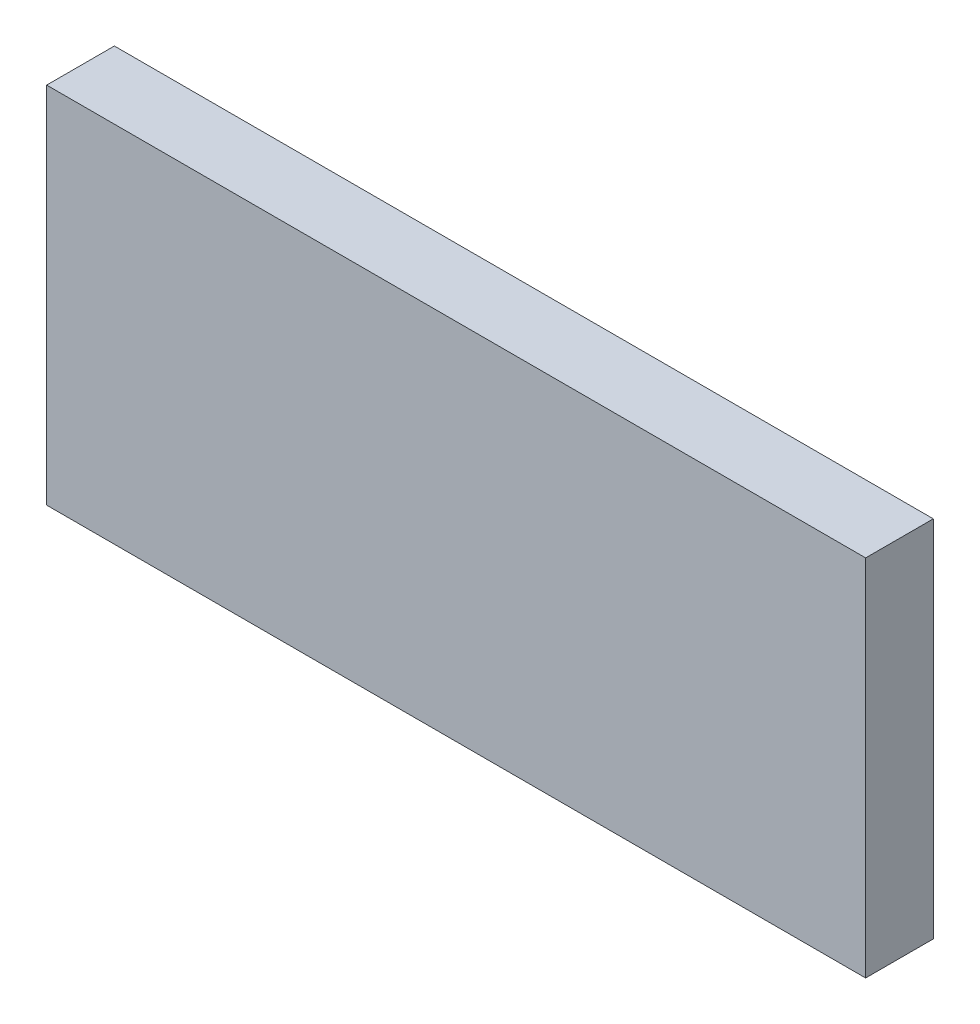
ISO-10303-21;
HEADER;
FILE_DESCRIPTION(('STEP AP214'),'2;1');
FILE_NAME('part.step','',(''),(''),'','','');
FILE_SCHEMA(('AUTOMOTIVE_DESIGN { 1 0 10303 214 1 1 1 1 }'));
ENDSEC;
DATA;
#1=APPLICATION_CONTEXT('core data for automotive mechanical design processes');
#2=APPLICATION_PROTOCOL_DEFINITION('international standard','automotive_design',2000,#1);
#3=PRODUCT_CONTEXT('',#1,'mechanical');
#4=PRODUCT('Part','Part','',(#3));
#5=PRODUCT_RELATED_PRODUCT_CATEGORY('part','',(#4));
#6=PRODUCT_DEFINITION_FORMATION('','',#4);
#7=PRODUCT_DEFINITION_CONTEXT('part definition',#1,'design');
#8=PRODUCT_DEFINITION('design','',#6,#7);
#9=PRODUCT_DEFINITION_SHAPE('','',#8);
#10=(LENGTH_UNIT() NAMED_UNIT(*) SI_UNIT(.MILLI.,.METRE.));
#11=(NAMED_UNIT(*) PLANE_ANGLE_UNIT() SI_UNIT($,.RADIAN.));
#12=(NAMED_UNIT(*) SI_UNIT($,.STERADIAN.) SOLID_ANGLE_UNIT());
#13=UNCERTAINTY_MEASURE_WITH_UNIT(LENGTH_MEASURE(1.E-05),#10,'distance_accuracy_value','');
#14=(GEOMETRIC_REPRESENTATION_CONTEXT(3) GLOBAL_UNCERTAINTY_ASSIGNED_CONTEXT((#13)) GLOBAL_UNIT_ASSIGNED_CONTEXT((#10,
#11,#12)) REPRESENTATION_CONTEXT('',''));
#15=CARTESIAN_POINT('',(0.,0.,0.));
#16=DIRECTION('',(0.,0.,1.));
#17=DIRECTION('',(1.,0.,0.));
#18=AXIS2_PLACEMENT_3D('',#15,#16,#17);
#19=CARTESIAN_POINT('',(-32.4999999999999,114.,207.725235860835));
#20=DIRECTION('',(0.,0.,-1.));
#21=DIRECTION('',(-1.,0.,0.));
#22=AXIS2_PLACEMENT_3D('',#19,#20,#21);
#23=PLANE('',#22);
#24=DIRECTION('',(-1.,0.,0.));
#25=VECTOR('',#24,1.);
#26=CARTESIAN_POINT('',(-32.4999999999999,25.9017282505961,207.725235860835));
#27=LINE('',#26,#25);
#28=CARTESIAN_POINT('',(24.2,25.9017282505961,207.725235860835));
#29=VERTEX_POINT('',#28);
#30=CARTESIAN_POINT('',(-24.1999999999999,25.9017282505961,207.725235860835));
#31=VERTEX_POINT('',#30);
#32=EDGE_CURVE('E74',#29,#31,#27,.T.);
#33=ORIENTED_EDGE('',*,*,#32,.F.);
#34=DIRECTION('',(0.,-1.,0.));
#35=VECTOR('',#34,1.);
#36=CARTESIAN_POINT('',(24.2,114.,207.725235860835));
#37=LINE('',#36,#35);
#38=CARTESIAN_POINT('',(24.2,4.4,207.725235860835));
#39=VERTEX_POINT('',#38);
#40=EDGE_CURVE('E89',#29,#39,#37,.T.);
#41=ORIENTED_EDGE('',*,*,#40,.T.);
#42=DIRECTION('',(1.,0.,0.));
#43=VECTOR('',#42,1.);
#44=CARTESIAN_POINT('',(-32.4999999999999,4.4,207.725235860835));
#45=LINE('',#44,#43);
#46=CARTESIAN_POINT('',(-24.1999999999999,4.4,207.725235860835));
#47=VERTEX_POINT('',#46);
#48=EDGE_CURVE('E97',#47,#39,#45,.T.);
#49=ORIENTED_EDGE('',*,*,#48,.F.);
#50=DIRECTION('',(0.,-1.,0.));
#51=VECTOR('',#50,1.);
#52=CARTESIAN_POINT('',(-24.1999999999999,114.,207.725235860835));
#53=LINE('',#52,#51);
#54=EDGE_CURVE('E42',#31,#47,#53,.T.);
#55=ORIENTED_EDGE('',*,*,#54,.F.);
#56=EDGE_LOOP('',(#33,#41,#49,#55));
#57=FACE_BOUND('',#56,.T.);
#58=ADVANCED_FACE('F35',(#57),#23,.T.);
#59=CARTESIAN_POINT('',(-32.4999999999999,4.,211.725235860835));
#60=DIRECTION('',(0.,0.,-1.));
#61=DIRECTION('',(-1.,0.,0.));
#62=AXIS2_PLACEMENT_3D('',#59,#60,#61);
#63=PLANE('',#62);
#64=DIRECTION('',(0.,1.,0.));
#65=VECTOR('',#64,1.);
#66=CARTESIAN_POINT('',(24.2,27.5681081407413,211.725235860835));
#67=LINE('',#66,#65);
#68=CARTESIAN_POINT('',(24.2,4.4,211.725235860835));
#69=VERTEX_POINT('',#68);
#70=CARTESIAN_POINT('',(24.2,25.9017282505961,211.725235860835));
#71=VERTEX_POINT('',#70);
#72=EDGE_CURVE('E83',#69,#71,#67,.T.);
#73=ORIENTED_EDGE('',*,*,#72,.T.);
#74=DIRECTION('',(1.,0.,0.));
#75=VECTOR('',#74,1.);
#76=CARTESIAN_POINT('',(-24.1999999999999,25.9017282505961,211.725235860835));
#77=LINE('',#76,#75);
#78=CARTESIAN_POINT('',(-24.1999999999999,25.9017282505961,211.725235860835));
#79=VERTEX_POINT('',#78);
#80=EDGE_CURVE('E49',#79,#71,#77,.T.);
#81=ORIENTED_EDGE('',*,*,#80,.F.);
#82=DIRECTION('',(0.,1.,0.));
#83=VECTOR('',#82,1.);
#84=CARTESIAN_POINT('',(-24.1999999999999,27.5681081407413,211.725235860835));
#85=LINE('',#84,#83);
#86=CARTESIAN_POINT('',(-24.1999999999999,4.4,211.725235860835));
#87=VERTEX_POINT('',#86);
#88=EDGE_CURVE('E81',#87,#79,#85,.T.);
#89=ORIENTED_EDGE('',*,*,#88,.F.);
#90=DIRECTION('',(-1.,0.,0.));
#91=VECTOR('',#90,1.);
#92=CARTESIAN_POINT('',(0.,4.4,211.725235860835));
#93=LINE('',#92,#91);
#94=EDGE_CURVE('E88',#69,#87,#93,.T.);
#95=ORIENTED_EDGE('',*,*,#94,.F.);
#96=EDGE_LOOP('',(#73,#81,#89,#95));
#97=FACE_BOUND('',#96,.T.);
#98=ADVANCED_FACE('F80',(#97),#63,.F.);
#99=CARTESIAN_POINT('',(-24.1999999999999,27.5681081407413,203.725235860835));
#100=DIRECTION('',(1.,0.,0.));
#101=DIRECTION('',(0.,0.,-1.));
#102=AXIS2_PLACEMENT_3D('',#99,#100,#101);
#103=PLANE('',#102);
#104=ORIENTED_EDGE('',*,*,#88,.T.);
#105=DIRECTION('',(0.,0.,1.));
#106=VECTOR('',#105,1.);
#107=CARTESIAN_POINT('',(-24.1999999999999,25.9017282505961,201.725235860835));
#108=LINE('',#107,#106);
#109=EDGE_CURVE('E71',#31,#79,#108,.T.);
#110=ORIENTED_EDGE('',*,*,#109,.F.);
#111=ORIENTED_EDGE('',*,*,#54,.T.);
#112=DIRECTION('',(0.,0.,1.));
#113=VECTOR('',#112,1.);
#114=CARTESIAN_POINT('',(-24.1999999999999,4.4,203.725235860835));
#115=LINE('',#114,#113);
#116=EDGE_CURVE('E86',#47,#87,#115,.T.);
#117=ORIENTED_EDGE('',*,*,#116,.T.);
#118=EDGE_LOOP('',(#104,#110,#111,#117));
#119=FACE_BOUND('',#118,.T.);
#120=ADVANCED_FACE('F85',(#119),#103,.F.);
#121=CARTESIAN_POINT('',(0.,4.4,203.725235860835));
#122=DIRECTION('',(0.,1.,0.));
#123=DIRECTION('',(-1.,0.,0.));
#124=AXIS2_PLACEMENT_3D('',#121,#122,#123);
#125=PLANE('',#124);
#126=ORIENTED_EDGE('',*,*,#48,.T.);
#127=DIRECTION('',(0.,0.,1.));
#128=VECTOR('',#127,1.);
#129=CARTESIAN_POINT('',(24.2,4.4,203.725235860835));
#130=LINE('',#129,#128);
#131=EDGE_CURVE('E92',#39,#69,#130,.T.);
#132=ORIENTED_EDGE('',*,*,#131,.T.);
#133=ORIENTED_EDGE('',*,*,#94,.T.);
#134=ORIENTED_EDGE('',*,*,#116,.F.);
#135=EDGE_LOOP('',(#126,#132,#133,#134));
#136=FACE_BOUND('',#135,.T.);
#137=ADVANCED_FACE('F103',(#136),#125,.F.);
#138=CARTESIAN_POINT('',(24.2,27.5681081407413,203.725235860835));
#139=DIRECTION('',(-1.,0.,0.));
#140=DIRECTION('',(0.,0.,-1.));
#141=AXIS2_PLACEMENT_3D('',#138,#139,#140);
#142=PLANE('',#141);
#143=ORIENTED_EDGE('',*,*,#40,.F.);
#144=DIRECTION('',(0.,0.,1.));
#145=VECTOR('',#144,1.);
#146=CARTESIAN_POINT('',(24.2,25.9017282505961,203.725235860835));
#147=LINE('',#146,#145);
#148=EDGE_CURVE('E11',#29,#71,#147,.T.);
#149=ORIENTED_EDGE('',*,*,#148,.T.);
#150=ORIENTED_EDGE('',*,*,#72,.F.);
#151=ORIENTED_EDGE('',*,*,#131,.F.);
#152=EDGE_LOOP('',(#143,#149,#150,#151));
#153=FACE_BOUND('',#152,.T.);
#154=ADVANCED_FACE('F107',(#153),#142,.F.);
#155=CARTESIAN_POINT('',(-24.1999999999999,25.9017282505961,201.725235860835));
#156=DIRECTION('',(0.,-1.,0.));
#157=DIRECTION('',(0.,0.,-1.));
#158=AXIS2_PLACEMENT_3D('',#155,#156,#157);
#159=PLANE('',#158);
#160=ORIENTED_EDGE('',*,*,#109,.T.);
#161=ORIENTED_EDGE('',*,*,#80,.T.);
#162=ORIENTED_EDGE('',*,*,#148,.F.);
#163=ORIENTED_EDGE('',*,*,#32,.T.);
#164=EDGE_LOOP('',(#160,#161,#162,#163));
#165=FACE_BOUND('',#164,.T.);
#166=ADVANCED_FACE('F72',(#165),#159,.F.);
#167=CLOSED_SHELL('',(#58,#98,#120,#137,#154,#166));
#168=MANIFOLD_SOLID_BREP('B2',#167);
#169=ADVANCED_BREP_SHAPE_REPRESENTATION('',(#18,#168),#14);
#170=SHAPE_DEFINITION_REPRESENTATION(#9,#169);
ENDSEC;
END-ISO-10303-21;
